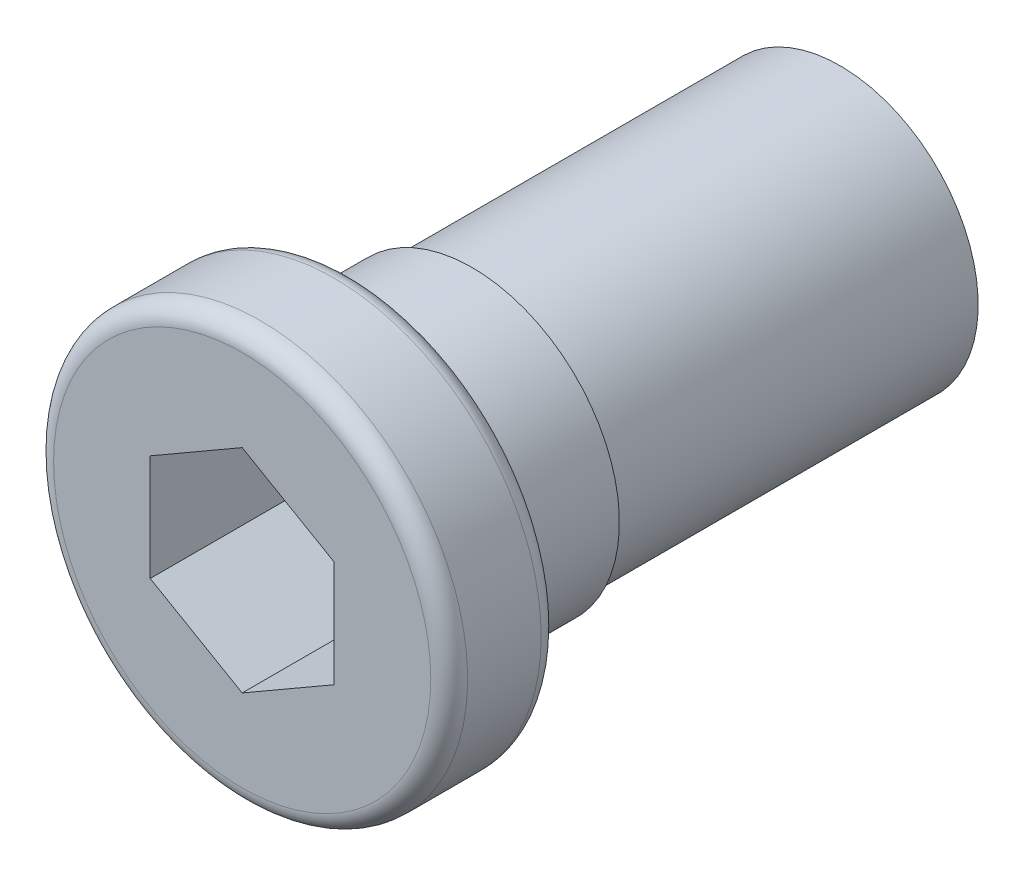
ISO-10303-21;
HEADER;
FILE_DESCRIPTION(('STEP AP214'),'2;1');
FILE_NAME('part.step','',(''),(''),'','','');
FILE_SCHEMA(('AUTOMOTIVE_DESIGN { 1 0 10303 214 1 1 1 1 }'));
ENDSEC;
DATA;
#1=APPLICATION_CONTEXT('core data for automotive mechanical design processes');
#2=APPLICATION_PROTOCOL_DEFINITION('international standard','automotive_design',2000,#1);
#3=PRODUCT_CONTEXT('',#1,'mechanical');
#4=PRODUCT('Part','Part','',(#3));
#5=PRODUCT_RELATED_PRODUCT_CATEGORY('part','',(#4));
#6=PRODUCT_DEFINITION_FORMATION('','',#4);
#7=PRODUCT_DEFINITION_CONTEXT('part definition',#1,'design');
#8=PRODUCT_DEFINITION('design','',#6,#7);
#9=PRODUCT_DEFINITION_SHAPE('','',#8);
#10=(LENGTH_UNIT() NAMED_UNIT(*) SI_UNIT(.MILLI.,.METRE.));
#11=(NAMED_UNIT(*) PLANE_ANGLE_UNIT() SI_UNIT($,.RADIAN.));
#12=(NAMED_UNIT(*) SI_UNIT($,.STERADIAN.) SOLID_ANGLE_UNIT());
#13=UNCERTAINTY_MEASURE_WITH_UNIT(LENGTH_MEASURE(1.E-05),#10,'distance_accuracy_value','');
#14=(GEOMETRIC_REPRESENTATION_CONTEXT(3) GLOBAL_UNCERTAINTY_ASSIGNED_CONTEXT((#13)) GLOBAL_UNIT_ASSIGNED_CONTEXT((#10,
#11,#12)) REPRESENTATION_CONTEXT('',''));
#15=CARTESIAN_POINT('',(0.,0.,0.));
#16=DIRECTION('',(0.,0.,1.));
#17=DIRECTION('',(1.,0.,0.));
#18=AXIS2_PLACEMENT_3D('',#15,#16,#17);
#19=CARTESIAN_POINT('',(0.,0.,5.));
#20=DIRECTION('',(0.,0.,1.));
#21=DIRECTION('',(1.,0.,0.));
#22=AXIS2_PLACEMENT_3D('',#19,#20,#21);
#23=PLANE('',#22);
#24=DIRECTION('',(0.866025403784439,0.5,0.));
#25=VECTOR('',#24,1.);
#26=CARTESIAN_POINT('',(0.,-1.15470053837925,5.));
#27=LINE('',#26,#25);
#28=CARTESIAN_POINT('',(0.,-1.15470053837925,5.));
#29=VERTEX_POINT('',#28);
#30=CARTESIAN_POINT('',(1.,-0.577350269189626,5.));
#31=VERTEX_POINT('',#30);
#32=EDGE_CURVE('E97',#29,#31,#27,.T.);
#33=ORIENTED_EDGE('',*,*,#32,.T.);
#34=DIRECTION('',(0.,1.,0.));
#35=VECTOR('',#34,1.);
#36=CARTESIAN_POINT('',(1.,-0.577350269189626,5.));
#37=LINE('',#36,#35);
#38=CARTESIAN_POINT('',(1.,0.577350269189626,5.));
#39=VERTEX_POINT('',#38);
#40=EDGE_CURVE('E100',#31,#39,#37,.T.);
#41=ORIENTED_EDGE('',*,*,#40,.T.);
#42=DIRECTION('',(-0.866025403784439,0.5,0.));
#43=VECTOR('',#42,1.);
#44=CARTESIAN_POINT('',(0.999999999999999,0.577350269189626,5.));
#45=LINE('',#44,#43);
#46=CARTESIAN_POINT('',(0.,1.15470053837925,5.));
#47=VERTEX_POINT('',#46);
#48=EDGE_CURVE('E102',#39,#47,#45,.T.);
#49=ORIENTED_EDGE('',*,*,#48,.T.);
#50=DIRECTION('',(-0.866025403784439,-0.5,0.));
#51=VECTOR('',#50,1.);
#52=CARTESIAN_POINT('',(0.,1.15470053837925,5.));
#53=LINE('',#52,#51);
#54=CARTESIAN_POINT('',(-1.,0.577350269189626,5.));
#55=VERTEX_POINT('',#54);
#56=EDGE_CURVE('E214',#47,#55,#53,.T.);
#57=ORIENTED_EDGE('',*,*,#56,.T.);
#58=DIRECTION('',(0.,-1.,0.));
#59=VECTOR('',#58,1.);
#60=CARTESIAN_POINT('',(-1.,0.577350269189626,5.));
#61=LINE('',#60,#59);
#62=CARTESIAN_POINT('',(-1.,-0.577350269189626,5.));
#63=VERTEX_POINT('',#62);
#64=EDGE_CURVE('E221',#55,#63,#61,.T.);
#65=ORIENTED_EDGE('',*,*,#64,.T.);
#66=DIRECTION('',(0.866025403784439,-0.5,0.));
#67=VECTOR('',#66,1.);
#68=CARTESIAN_POINT('',(-1.,-0.577350269189626,5.));
#69=LINE('',#68,#67);
#70=EDGE_CURVE('E227',#63,#29,#69,.T.);
#71=ORIENTED_EDGE('',*,*,#70,.T.);
#72=EDGE_LOOP('',(#33,#41,#49,#57,#65,#71));
#73=FACE_BOUND('',#72,.T.);
#74=ADVANCED_FACE('F16',(#73),#23,.T.);
#75=CARTESIAN_POINT('',(0.999999999999999,0.577350269189626,5.));
#76=DIRECTION('',(0.5,0.866025403784439,0.));
#77=DIRECTION('',(-0.866025403784439,0.5,0.));
#78=AXIS2_PLACEMENT_3D('',#75,#76,#77);
#79=PLANE('',#78);
#80=DIRECTION('',(0.,0.,1.));
#81=VECTOR('',#80,1.);
#82=CARTESIAN_POINT('',(0.,1.15470053837925,5.));
#83=LINE('',#82,#81);
#84=CARTESIAN_POINT('',(0.,1.15470053837925,6.5));
#85=VERTEX_POINT('',#84);
#86=EDGE_CURVE('E114',#85,#47,#83,.F.);
#87=ORIENTED_EDGE('',*,*,#86,.T.);
#88=ORIENTED_EDGE('',*,*,#48,.F.);
#89=DIRECTION('',(0.,0.,1.));
#90=VECTOR('',#89,1.);
#91=CARTESIAN_POINT('',(0.999999999999999,0.577350269189626,5.));
#92=LINE('',#91,#90);
#93=CARTESIAN_POINT('',(0.999999999999999,0.577350269189626,6.5));
#94=VERTEX_POINT('',#93);
#95=EDGE_CURVE('E108',#39,#94,#92,.T.);
#96=ORIENTED_EDGE('',*,*,#95,.T.);
#97=DIRECTION('',(0.866025403784439,-0.5,0.));
#98=VECTOR('',#97,1.);
#99=CARTESIAN_POINT('',(0.,1.15470053837925,6.5));
#100=LINE('',#99,#98);
#101=EDGE_CURVE('E213',#85,#94,#100,.T.);
#102=ORIENTED_EDGE('',*,*,#101,.F.);
#103=EDGE_LOOP('',(#87,#88,#96,#102));
#104=FACE_BOUND('',#103,.T.);
#105=ADVANCED_FACE('F111',(#104),#79,.F.);
#106=CARTESIAN_POINT('',(1.,-0.577350269189626,5.));
#107=DIRECTION('',(1.,0.,0.));
#108=DIRECTION('',(0.,1.,0.));
#109=AXIS2_PLACEMENT_3D('',#106,#107,#108);
#110=PLANE('',#109);
#111=ORIENTED_EDGE('',*,*,#95,.F.);
#112=ORIENTED_EDGE('',*,*,#40,.F.);
#113=DIRECTION('',(0.,0.,1.));
#114=VECTOR('',#113,1.);
#115=CARTESIAN_POINT('',(1.,-0.577350269189626,5.));
#116=LINE('',#115,#114);
#117=CARTESIAN_POINT('',(1.,-0.577350269189626,6.5));
#118=VERTEX_POINT('',#117);
#119=EDGE_CURVE('E127',#31,#118,#116,.T.);
#120=ORIENTED_EDGE('',*,*,#119,.T.);
#121=DIRECTION('',(0.,1.,0.));
#122=VECTOR('',#121,1.);
#123=CARTESIAN_POINT('',(0.999999999999999,0.,6.5));
#124=LINE('',#123,#122);
#125=EDGE_CURVE('E120',#94,#118,#124,.F.);
#126=ORIENTED_EDGE('',*,*,#125,.F.);
#127=EDGE_LOOP('',(#111,#112,#120,#126));
#128=FACE_BOUND('',#127,.T.);
#129=ADVANCED_FACE('F118',(#128),#110,.F.);
#130=CARTESIAN_POINT('',(0.,-1.15470053837925,5.));
#131=DIRECTION('',(0.5,-0.866025403784439,0.));
#132=DIRECTION('',(0.866025403784439,0.5,0.));
#133=AXIS2_PLACEMENT_3D('',#130,#131,#132);
#134=PLANE('',#133);
#135=ORIENTED_EDGE('',*,*,#119,.F.);
#136=ORIENTED_EDGE('',*,*,#32,.F.);
#137=DIRECTION('',(0.,0.,1.));
#138=VECTOR('',#137,1.);
#139=CARTESIAN_POINT('',(0.,-1.15470053837925,5.));
#140=LINE('',#139,#138);
#141=CARTESIAN_POINT('',(0.,-1.15470053837925,6.5));
#142=VERTEX_POINT('',#141);
#143=EDGE_CURVE('E224',#29,#142,#140,.T.);
#144=ORIENTED_EDGE('',*,*,#143,.T.);
#145=DIRECTION('',(-0.866025403784439,-0.5,0.));
#146=VECTOR('',#145,1.);
#147=CARTESIAN_POINT('',(1.,-0.577350269189626,6.5));
#148=LINE('',#147,#146);
#149=EDGE_CURVE('E235',#118,#142,#148,.T.);
#150=ORIENTED_EDGE('',*,*,#149,.F.);
#151=EDGE_LOOP('',(#135,#136,#144,#150));
#152=FACE_BOUND('',#151,.T.);
#153=ADVANCED_FACE('F236',(#152),#134,.F.);
#154=CARTESIAN_POINT('',(-1.,-0.577350269189626,5.));
#155=DIRECTION('',(-0.5,-0.866025403784439,0.));
#156=DIRECTION('',(0.866025403784439,-0.5,0.));
#157=AXIS2_PLACEMENT_3D('',#154,#155,#156);
#158=PLANE('',#157);
#159=ORIENTED_EDGE('',*,*,#143,.F.);
#160=ORIENTED_EDGE('',*,*,#70,.F.);
#161=DIRECTION('',(0.,0.,1.));
#162=VECTOR('',#161,1.);
#163=CARTESIAN_POINT('',(-1.,-0.577350269189626,5.));
#164=LINE('',#163,#162);
#165=CARTESIAN_POINT('',(-1.,-0.577350269189626,6.5));
#166=VERTEX_POINT('',#165);
#167=EDGE_CURVE('E218',#63,#166,#164,.T.);
#168=ORIENTED_EDGE('',*,*,#167,.T.);
#169=DIRECTION('',(-0.866025403784439,0.5,0.));
#170=VECTOR('',#169,1.);
#171=CARTESIAN_POINT('',(0.,-1.15470053837925,6.5));
#172=LINE('',#171,#170);
#173=EDGE_CURVE('E242',#142,#166,#172,.T.);
#174=ORIENTED_EDGE('',*,*,#173,.F.);
#175=EDGE_LOOP('',(#159,#160,#168,#174));
#176=FACE_BOUND('',#175,.T.);
#177=ADVANCED_FACE('F365',(#176),#158,.F.);
#178=CARTESIAN_POINT('',(-1.,0.577350269189626,5.));
#179=DIRECTION('',(-1.,0.,0.));
#180=DIRECTION('',(0.,-1.,0.));
#181=AXIS2_PLACEMENT_3D('',#178,#179,#180);
#182=PLANE('',#181);
#183=ORIENTED_EDGE('',*,*,#167,.F.);
#184=ORIENTED_EDGE('',*,*,#64,.F.);
#185=DIRECTION('',(0.,0.,1.));
#186=VECTOR('',#185,1.);
#187=CARTESIAN_POINT('',(-1.,0.577350269189626,5.));
#188=LINE('',#187,#186);
#189=CARTESIAN_POINT('',(-1.,0.577350269189626,6.5));
#190=VERTEX_POINT('',#189);
#191=EDGE_CURVE('E205',#55,#190,#188,.T.);
#192=ORIENTED_EDGE('',*,*,#191,.T.);
#193=DIRECTION('',(0.,1.,0.));
#194=VECTOR('',#193,1.);
#195=CARTESIAN_POINT('',(-1.,0.,6.5));
#196=LINE('',#195,#194);
#197=EDGE_CURVE('E252',#166,#190,#196,.T.);
#198=ORIENTED_EDGE('',*,*,#197,.F.);
#199=EDGE_LOOP('',(#183,#184,#192,#198));
#200=FACE_BOUND('',#199,.T.);
#201=ADVANCED_FACE('F287',(#200),#182,.F.);
#202=CARTESIAN_POINT('',(0.,1.15470053837925,5.));
#203=DIRECTION('',(-0.5,0.866025403784439,0.));
#204=DIRECTION('',(-0.866025403784439,-0.5,0.));
#205=AXIS2_PLACEMENT_3D('',#202,#203,#204);
#206=PLANE('',#205);
#207=ORIENTED_EDGE('',*,*,#191,.F.);
#208=ORIENTED_EDGE('',*,*,#56,.F.);
#209=ORIENTED_EDGE('',*,*,#86,.F.);
#210=DIRECTION('',(0.866025403784439,0.5,0.));
#211=VECTOR('',#210,1.);
#212=CARTESIAN_POINT('',(-1.,0.577350269189626,6.5));
#213=LINE('',#212,#211);
#214=EDGE_CURVE('E255',#190,#85,#213,.T.);
#215=ORIENTED_EDGE('',*,*,#214,.F.);
#216=EDGE_LOOP('',(#207,#208,#209,#215));
#217=FACE_BOUND('',#216,.T.);
#218=ADVANCED_FACE('F282',(#217),#206,.F.);
#219=CARTESIAN_POINT('',(0.,0.,6.5));
#220=DIRECTION('',(0.,0.,1.));
#221=DIRECTION('',(1.,0.,0.));
#222=AXIS2_PLACEMENT_3D('',#219,#220,#221);
#223=PLANE('',#222);
#224=ORIENTED_EDGE('',*,*,#197,.T.);
#225=ORIENTED_EDGE('',*,*,#214,.T.);
#226=ORIENTED_EDGE('',*,*,#101,.T.);
#227=ORIENTED_EDGE('',*,*,#125,.T.);
#228=ORIENTED_EDGE('',*,*,#149,.T.);
#229=ORIENTED_EDGE('',*,*,#173,.T.);
#230=EDGE_LOOP('',(#224,#225,#226,#227,#228,#229));
#231=FACE_BOUND('',#230,.T.);
#232=CARTESIAN_POINT('',(0.,0.,6.5));
#233=DIRECTION('',(0.,0.,-1.));
#234=DIRECTION('',(-1.,0.,0.));
#235=AXIS2_PLACEMENT_3D('',#232,#233,#234);
#236=CIRCLE('',#235,2.05);
#237=CARTESIAN_POINT('',(-2.05,0.,6.5));
#238=VERTEX_POINT('',#237);
#239=CARTESIAN_POINT('',(2.05,0.,6.5));
#240=VERTEX_POINT('',#239);
#241=EDGE_CURVE('E258',#238,#240,#236,.T.);
#242=ORIENTED_EDGE('',*,*,#241,.F.);
#243=CARTESIAN_POINT('',(0.,0.,6.5));
#244=DIRECTION('',(0.,0.,-1.));
#245=DIRECTION('',(1.,0.,0.));
#246=AXIS2_PLACEMENT_3D('',#243,#244,#245);
#247=CIRCLE('',#246,2.05);
#248=EDGE_CURVE('E185',#240,#238,#247,.T.);
#249=ORIENTED_EDGE('',*,*,#248,.F.);
#250=EDGE_LOOP('',(#242,#249));
#251=FACE_BOUND('',#250,.T.);
#252=ADVANCED_FACE('F193',(#231,#251),#223,.T.);
#253=CARTESIAN_POINT('',(0.,0.,6.3));
#254=DIRECTION('',(0.,0.,1.));
#255=DIRECTION('',(1.,0.,0.));
#256=AXIS2_PLACEMENT_3D('',#253,#254,#255);
#257=TOROIDAL_SURFACE('',#256,2.05,0.2);
#258=CARTESIAN_POINT('',(0.,0.,6.3));
#259=DIRECTION('',(0.,0.,-1.));
#260=DIRECTION('',(-1.,0.,0.));
#261=AXIS2_PLACEMENT_3D('',#258,#259,#260);
#262=CIRCLE('',#261,2.25);
#263=CARTESIAN_POINT('',(-2.25,0.,6.3));
#264=VERTEX_POINT('',#263);
#265=EDGE_CURVE('E181',#264,#264,#262,.T.);
#266=ORIENTED_EDGE('',*,*,#265,.F.);
#267=EDGE_LOOP('',(#266));
#268=FACE_BOUND('',#267,.T.);
#269=ORIENTED_EDGE('',*,*,#248,.T.);
#270=ORIENTED_EDGE('',*,*,#241,.T.);
#271=EDGE_LOOP('',(#269,#270));
#272=FACE_BOUND('',#271,.T.);
#273=ADVANCED_FACE('F189',(#268,#272),#257,.T.);
#274=CARTESIAN_POINT('',(0.,0.,6.5));
#275=DIRECTION('',(0.,0.,-1.));
#276=DIRECTION('',(-1.,0.,0.));
#277=AXIS2_PLACEMENT_3D('',#274,#275,#276);
#278=CYLINDRICAL_SURFACE('',#277,2.25);
#279=ORIENTED_EDGE('',*,*,#265,.T.);
#280=EDGE_LOOP('',(#279));
#281=FACE_BOUND('',#280,.T.);
#282=CARTESIAN_POINT('',(0.,0.,5.5));
#283=DIRECTION('',(0.,0.,1.));
#284=DIRECTION('',(1.,0.,0.));
#285=AXIS2_PLACEMENT_3D('',#282,#283,#284);
#286=CIRCLE('',#285,2.25);
#287=CARTESIAN_POINT('',(2.25,0.,5.5));
#288=VERTEX_POINT('',#287);
#289=EDGE_CURVE('E172',#288,#288,#286,.F.);
#290=ORIENTED_EDGE('',*,*,#289,.F.);
#291=EDGE_LOOP('',(#290));
#292=FACE_BOUND('',#291,.T.);
#293=ADVANCED_FACE('F158',(#281,#292),#278,.T.);
#294=CARTESIAN_POINT('',(0.,0.,5.5));
#295=DIRECTION('',(0.,0.,1.));
#296=DIRECTION('',(1.,0.,0.));
#297=AXIS2_PLACEMENT_3D('',#294,#295,#296);
#298=TOROIDAL_SURFACE('',#297,2.05,0.2);
#299=CARTESIAN_POINT('',(0.,0.,5.3));
#300=DIRECTION('',(0.,0.,1.));
#301=DIRECTION('',(1.,0.,0.));
#302=AXIS2_PLACEMENT_3D('',#299,#300,#301);
#303=CIRCLE('',#302,2.05);
#304=CARTESIAN_POINT('',(2.05,0.,5.3));
#305=VERTEX_POINT('',#304);
#306=CARTESIAN_POINT('',(-2.05,0.,5.3));
#307=VERTEX_POINT('',#306);
#308=EDGE_CURVE('E40',#305,#307,#303,.T.);
#309=ORIENTED_EDGE('',*,*,#308,.T.);
#310=CARTESIAN_POINT('',(0.,0.,5.3));
#311=DIRECTION('',(0.,0.,1.));
#312=DIRECTION('',(-1.,0.,0.));
#313=AXIS2_PLACEMENT_3D('',#310,#311,#312);
#314=CIRCLE('',#313,2.05);
#315=EDGE_CURVE('E141',#307,#305,#314,.T.);
#316=ORIENTED_EDGE('',*,*,#315,.T.);
#317=EDGE_LOOP('',(#309,#316));
#318=FACE_BOUND('',#317,.T.);
#319=ORIENTED_EDGE('',*,*,#289,.T.);
#320=EDGE_LOOP('',(#319));
#321=FACE_BOUND('',#320,.T.);
#322=ADVANCED_FACE('F146',(#318,#321),#298,.T.);
#323=CARTESIAN_POINT('',(0.,0.,5.3));
#324=DIRECTION('',(0.,0.,1.));
#325=DIRECTION('',(1.,0.,0.));
#326=AXIS2_PLACEMENT_3D('',#323,#324,#325);
#327=PLANE('',#326);
#328=CARTESIAN_POINT('',(0.,0.,5.3));
#329=DIRECTION('',(0.,0.,-1.));
#330=DIRECTION('',(-1.,0.,0.));
#331=AXIS2_PLACEMENT_3D('',#328,#329,#330);
#332=CIRCLE('',#331,1.6);
#333=CARTESIAN_POINT('',(-1.6,0.,5.3));
#334=VERTEX_POINT('',#333);
#335=EDGE_CURVE('E138',#334,#334,#332,.T.);
#336=ORIENTED_EDGE('',*,*,#335,.F.);
#337=EDGE_LOOP('',(#336));
#338=FACE_BOUND('',#337,.T.);
#339=ORIENTED_EDGE('',*,*,#308,.F.);
#340=ORIENTED_EDGE('',*,*,#315,.F.);
#341=EDGE_LOOP('',(#339,#340));
#342=FACE_BOUND('',#341,.T.);
#343=ADVANCED_FACE('F157',(#338,#342),#327,.F.);
#344=CARTESIAN_POINT('',(0.,0.,5.3));
#345=DIRECTION('',(0.,0.,-1.));
#346=DIRECTION('',(-1.,0.,0.));
#347=AXIS2_PLACEMENT_3D('',#344,#345,#346);
#348=CYLINDRICAL_SURFACE('',#347,1.6);
#349=ORIENTED_EDGE('',*,*,#335,.T.);
#350=EDGE_LOOP('',(#349));
#351=FACE_BOUND('',#350,.T.);
#352=CARTESIAN_POINT('',(0.,0.,4.));
#353=DIRECTION('',(0.,0.,-1.));
#354=DIRECTION('',(-1.,0.,0.));
#355=AXIS2_PLACEMENT_3D('',#352,#353,#354);
#356=CIRCLE('',#355,1.6);
#357=CARTESIAN_POINT('',(-1.6,0.,4.));
#358=VERTEX_POINT('',#357);
#359=EDGE_CURVE('E134',#358,#358,#356,.F.);
#360=ORIENTED_EDGE('',*,*,#359,.T.);
#361=EDGE_LOOP('',(#360));
#362=FACE_BOUND('',#361,.T.);
#363=ADVANCED_FACE('F303',(#351,#362),#348,.T.);
#364=CARTESIAN_POINT('',(0.,0.,4.));
#365=DIRECTION('',(0.,0.,1.));
#366=DIRECTION('',(1.,0.,0.));
#367=AXIS2_PLACEMENT_3D('',#364,#365,#366);
#368=PLANE('',#367);
#369=CARTESIAN_POINT('',(0.,0.,4.));
#370=DIRECTION('',(0.,0.,-1.));
#371=DIRECTION('',(-1.,0.,0.));
#372=AXIS2_PLACEMENT_3D('',#369,#370,#371);
#373=CIRCLE('',#372,1.5);
#374=CARTESIAN_POINT('',(-1.5,0.,4.));
#375=VERTEX_POINT('',#374);
#376=EDGE_CURVE('E28',#375,#375,#373,.T.);
#377=ORIENTED_EDGE('',*,*,#376,.F.);
#378=EDGE_LOOP('',(#377));
#379=FACE_BOUND('',#378,.T.);
#380=ORIENTED_EDGE('',*,*,#359,.F.);
#381=EDGE_LOOP('',(#380));
#382=FACE_BOUND('',#381,.T.);
#383=ADVANCED_FACE('F297',(#379,#382),#368,.F.);
#384=CARTESIAN_POINT('',(0.,0.,0.));
#385=DIRECTION('',(0.,0.,1.));
#386=DIRECTION('',(1.,0.,0.));
#387=AXIS2_PLACEMENT_3D('',#384,#385,#386);
#388=PLANE('',#387);
#389=CARTESIAN_POINT('',(0.,0.,0.));
#390=DIRECTION('',(0.,0.,-1.));
#391=DIRECTION('',(-1.,0.,0.));
#392=AXIS2_PLACEMENT_3D('',#389,#390,#391);
#393=CIRCLE('',#392,1.5);
#394=CARTESIAN_POINT('',(-1.5,0.,0.));
#395=VERTEX_POINT('',#394);
#396=EDGE_CURVE('E11',#395,#395,#393,.F.);
#397=ORIENTED_EDGE('',*,*,#396,.F.);
#398=EDGE_LOOP('',(#397));
#399=FACE_BOUND('',#398,.T.);
#400=ADVANCED_FACE('F291',(#399),#388,.F.);
#401=CARTESIAN_POINT('',(0.,0.,4.));
#402=DIRECTION('',(0.,0.,-1.));
#403=DIRECTION('',(-1.,0.,0.));
#404=AXIS2_PLACEMENT_3D('',#401,#402,#403);
#405=CYLINDRICAL_SURFACE('',#404,1.5);
#406=ORIENTED_EDGE('',*,*,#396,.T.);
#407=EDGE_LOOP('',(#406));
#408=FACE_BOUND('',#407,.T.);
#409=ORIENTED_EDGE('',*,*,#376,.T.);
#410=EDGE_LOOP('',(#409));
#411=FACE_BOUND('',#410,.T.);
#412=ADVANCED_FACE('F289',(#408,#411),#405,.T.);
#413=CLOSED_SHELL('',(#74,#105,#129,#153,#177,#201,#218,#252,#273,#293,#322,#343,#363,#383,#400,#412));
#414=MANIFOLD_SOLID_BREP('B1',#413);
#415=ADVANCED_BREP_SHAPE_REPRESENTATION('',(#18,#414),#14);
#416=SHAPE_DEFINITION_REPRESENTATION(#9,#415);
ENDSEC;
END-ISO-10303-21;
